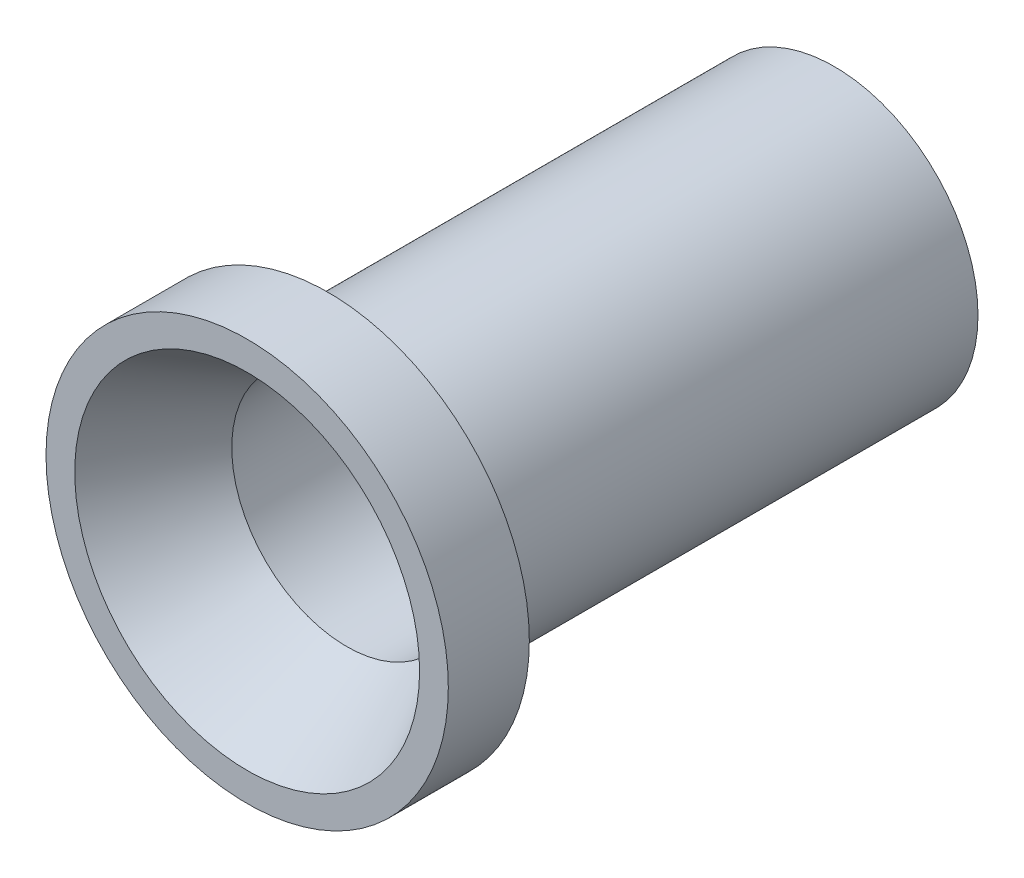
ISO-10303-21;
HEADER;
FILE_DESCRIPTION(('STEP AP214'),'2;1');
FILE_NAME('part.step','',(''),(''),'','','');
FILE_SCHEMA(('AUTOMOTIVE_DESIGN { 1 0 10303 214 1 1 1 1 }'));
ENDSEC;
DATA;
#1=APPLICATION_CONTEXT('core data for automotive mechanical design processes');
#2=APPLICATION_PROTOCOL_DEFINITION('international standard','automotive_design',2000,#1);
#3=PRODUCT_CONTEXT('',#1,'mechanical');
#4=PRODUCT('Part','Part','',(#3));
#5=PRODUCT_RELATED_PRODUCT_CATEGORY('part','',(#4));
#6=PRODUCT_DEFINITION_FORMATION('','',#4);
#7=PRODUCT_DEFINITION_CONTEXT('part definition',#1,'design');
#8=PRODUCT_DEFINITION('design','',#6,#7);
#9=PRODUCT_DEFINITION_SHAPE('','',#8);
#10=(LENGTH_UNIT() NAMED_UNIT(*) SI_UNIT(.MILLI.,.METRE.));
#11=(NAMED_UNIT(*) PLANE_ANGLE_UNIT() SI_UNIT($,.RADIAN.));
#12=(NAMED_UNIT(*) SI_UNIT($,.STERADIAN.) SOLID_ANGLE_UNIT());
#13=UNCERTAINTY_MEASURE_WITH_UNIT(LENGTH_MEASURE(1.E-05),#10,'distance_accuracy_value','');
#14=(GEOMETRIC_REPRESENTATION_CONTEXT(3) GLOBAL_UNCERTAINTY_ASSIGNED_CONTEXT((#13)) GLOBAL_UNIT_ASSIGNED_CONTEXT((#10,
#11,#12)) REPRESENTATION_CONTEXT('',''));
#15=CARTESIAN_POINT('',(0.,0.,0.));
#16=DIRECTION('',(0.,0.,1.));
#17=DIRECTION('',(1.,0.,0.));
#18=AXIS2_PLACEMENT_3D('',#15,#16,#17);
#19=CARTESIAN_POINT('',(0.,0.,0.));
#20=DIRECTION('',(0.,0.,1.));
#21=DIRECTION('',(1.,0.,0.));
#22=AXIS2_PLACEMENT_3D('',#19,#20,#21);
#23=CYLINDRICAL_SURFACE('',#22,35.);
#24=CARTESIAN_POINT('',(0.,0.,2.15777027302477));
#25=DIRECTION('',(0.,0.,1.));
#26=DIRECTION('',(1.,0.,0.));
#27=AXIS2_PLACEMENT_3D('',#24,#25,#26);
#28=CIRCLE('',#27,35.);
#29=CARTESIAN_POINT('',(35.,0.,2.15777027302477));
#30=VERTEX_POINT('',#29);
#31=EDGE_CURVE('E72',#30,#30,#28,.T.);
#32=ORIENTED_EDGE('',*,*,#31,.F.);
#33=EDGE_LOOP('',(#32));
#34=FACE_BOUND('',#33,.T.);
#35=CARTESIAN_POINT('',(0.,0.,-11.9365240935934));
#36=DIRECTION('',(0.,0.,1.));
#37=DIRECTION('',(1.,0.,0.));
#38=AXIS2_PLACEMENT_3D('',#35,#36,#37);
#39=CIRCLE('',#38,35.);
#40=CARTESIAN_POINT('',(35.,0.,-11.9365240935934));
#41=VERTEX_POINT('',#40);
#42=EDGE_CURVE('E12',#41,#41,#39,.T.);
#43=ORIENTED_EDGE('',*,*,#42,.T.);
#44=EDGE_LOOP('',(#43));
#45=FACE_BOUND('',#44,.T.);
#46=ADVANCED_FACE('F44',(#34,#45),#23,.T.);
#47=CARTESIAN_POINT('',(0.,35.,-11.9365240935934));
#48=DIRECTION('',(0.,0.,1.));
#49=DIRECTION('',(1.,0.,0.));
#50=AXIS2_PLACEMENT_3D('',#47,#48,#49);
#51=PLANE('',#50);
#52=ORIENTED_EDGE('',*,*,#42,.F.);
#53=EDGE_LOOP('',(#52));
#54=FACE_BOUND('',#53,.T.);
#55=CARTESIAN_POINT('',(0.,0.,-11.9365240935934));
#56=DIRECTION('',(0.,0.,1.));
#57=DIRECTION('',(1.,0.,0.));
#58=AXIS2_PLACEMENT_3D('',#55,#56,#57);
#59=CIRCLE('',#58,27.6332325454533);
#60=CARTESIAN_POINT('',(27.6332325454533,0.,-11.9365240935934));
#61=VERTEX_POINT('',#60);
#62=EDGE_CURVE('E50',#61,#61,#59,.T.);
#63=ORIENTED_EDGE('',*,*,#62,.T.);
#64=EDGE_LOOP('',(#63));
#65=FACE_BOUND('',#64,.T.);
#66=ADVANCED_FACE('F79',(#54,#65),#51,.F.);
#67=CARTESIAN_POINT('',(0.,0.,-16.4974166504624));
#68=DIRECTION('',(0.,0.,1.));
#69=DIRECTION('',(1.,0.,0.));
#70=AXIS2_PLACEMENT_3D('',#67,#68,#69);
#71=CONICAL_SURFACE('',#70,25.,0.5235987755983);
#72=ORIENTED_EDGE('',*,*,#62,.F.);
#73=EDGE_LOOP('',(#72));
#74=FACE_BOUND('',#73,.T.);
#75=CARTESIAN_POINT('',(0.,0.,-16.4974166504624));
#76=DIRECTION('',(0.,0.,1.));
#77=DIRECTION('',(1.,0.,0.));
#78=AXIS2_PLACEMENT_3D('',#75,#76,#77);
#79=CIRCLE('',#78,25.);
#80=CARTESIAN_POINT('',(25.,0.,-16.4974166504624));
#81=VERTEX_POINT('',#80);
#82=EDGE_CURVE('E54',#81,#81,#79,.T.);
#83=ORIENTED_EDGE('',*,*,#82,.T.);
#84=EDGE_LOOP('',(#83));
#85=FACE_BOUND('',#84,.T.);
#86=ADVANCED_FACE('F83',(#74,#85),#71,.T.);
#87=CARTESIAN_POINT('',(0.,0.,0.));
#88=DIRECTION('',(0.,0.,1.));
#89=DIRECTION('',(1.,0.,0.));
#90=AXIS2_PLACEMENT_3D('',#87,#88,#89);
#91=CYLINDRICAL_SURFACE('',#90,25.);
#92=ORIENTED_EDGE('',*,*,#82,.F.);
#93=EDGE_LOOP('',(#92));
#94=FACE_BOUND('',#93,.T.);
#95=CARTESIAN_POINT('',(0.,0.,-100.));
#96=DIRECTION('',(0.,0.,1.));
#97=DIRECTION('',(1.,0.,0.));
#98=AXIS2_PLACEMENT_3D('',#95,#96,#97);
#99=CIRCLE('',#98,25.);
#100=CARTESIAN_POINT('',(25.,0.,-100.));
#101=VERTEX_POINT('',#100);
#102=EDGE_CURVE('E58',#101,#101,#99,.T.);
#103=ORIENTED_EDGE('',*,*,#102,.T.);
#104=EDGE_LOOP('',(#103));
#105=FACE_BOUND('',#104,.T.);
#106=ADVANCED_FACE('F88',(#94,#105),#91,.T.);
#107=CARTESIAN_POINT('',(0.,25.,-100.));
#108=DIRECTION('',(0.,0.,1.));
#109=DIRECTION('',(1.,0.,0.));
#110=AXIS2_PLACEMENT_3D('',#107,#108,#109);
#111=PLANE('',#110);
#112=ORIENTED_EDGE('',*,*,#102,.F.);
#113=EDGE_LOOP('',(#112));
#114=FACE_BOUND('',#113,.T.);
#115=CARTESIAN_POINT('',(0.,0.,-100.));
#116=DIRECTION('',(0.,0.,1.));
#117=DIRECTION('',(1.,0.,0.));
#118=AXIS2_PLACEMENT_3D('',#115,#116,#117);
#119=CIRCLE('',#118,20.);
#120=CARTESIAN_POINT('',(20.,0.,-100.));
#121=VERTEX_POINT('',#120);
#122=EDGE_CURVE('E63',#121,#121,#119,.T.);
#123=ORIENTED_EDGE('',*,*,#122,.T.);
#124=EDGE_LOOP('',(#123));
#125=FACE_BOUND('',#124,.T.);
#126=ADVANCED_FACE('F94',(#114,#125),#111,.F.);
#127=CARTESIAN_POINT('',(0.,0.,0.));
#128=DIRECTION('',(0.,0.,1.));
#129=DIRECTION('',(1.,0.,0.));
#130=AXIS2_PLACEMENT_3D('',#127,#128,#129);
#131=CYLINDRICAL_SURFACE('',#130,20.);
#132=ORIENTED_EDGE('',*,*,#122,.F.);
#133=EDGE_LOOP('',(#132));
#134=FACE_BOUND('',#133,.T.);
#135=CARTESIAN_POINT('',(0.,0.,-15.162737802664));
#136=DIRECTION('',(0.,0.,1.));
#137=DIRECTION('',(1.,0.,0.));
#138=AXIS2_PLACEMENT_3D('',#135,#136,#137);
#139=CIRCLE('',#138,20.);
#140=CARTESIAN_POINT('',(20.,0.,-15.162737802664));
#141=VERTEX_POINT('',#140);
#142=EDGE_CURVE('E66',#141,#141,#139,.T.);
#143=ORIENTED_EDGE('',*,*,#142,.T.);
#144=EDGE_LOOP('',(#143));
#145=FACE_BOUND('',#144,.T.);
#146=ADVANCED_FACE('F98',(#134,#145),#131,.F.);
#147=CARTESIAN_POINT('',(0.,0.,2.15777027302477));
#148=DIRECTION('',(0.,0.,1.));
#149=DIRECTION('',(1.,0.,0.));
#150=AXIS2_PLACEMENT_3D('',#147,#148,#149);
#151=CONICAL_SURFACE('',#150,30.,0.5235987755983);
#152=ORIENTED_EDGE('',*,*,#142,.F.);
#153=EDGE_LOOP('',(#152));
#154=FACE_BOUND('',#153,.T.);
#155=CARTESIAN_POINT('',(0.,0.,2.15777027302477));
#156=DIRECTION('',(0.,0.,1.));
#157=DIRECTION('',(1.,0.,0.));
#158=AXIS2_PLACEMENT_3D('',#155,#156,#157);
#159=CIRCLE('',#158,30.);
#160=CARTESIAN_POINT('',(30.,0.,2.15777027302477));
#161=VERTEX_POINT('',#160);
#162=EDGE_CURVE('E69',#161,#161,#159,.T.);
#163=ORIENTED_EDGE('',*,*,#162,.T.);
#164=EDGE_LOOP('',(#163));
#165=FACE_BOUND('',#164,.T.);
#166=ADVANCED_FACE('F102',(#154,#165),#151,.F.);
#167=CARTESIAN_POINT('',(0.,30.,2.15777027302477));
#168=DIRECTION('',(0.,0.,-1.));
#169=DIRECTION('',(-1.,0.,0.));
#170=AXIS2_PLACEMENT_3D('',#167,#168,#169);
#171=PLANE('',#170);
#172=ORIENTED_EDGE('',*,*,#162,.F.);
#173=EDGE_LOOP('',(#172));
#174=FACE_BOUND('',#173,.T.);
#175=ORIENTED_EDGE('',*,*,#31,.T.);
#176=EDGE_LOOP('',(#175));
#177=FACE_BOUND('',#176,.T.);
#178=ADVANCED_FACE('F76',(#174,#177),#171,.F.);
#179=CLOSED_SHELL('',(#46,#66,#86,#106,#126,#146,#166,#178));
#180=MANIFOLD_SOLID_BREP('B2',#179);
#181=ADVANCED_BREP_SHAPE_REPRESENTATION('',(#18,#180),#14);
#182=SHAPE_DEFINITION_REPRESENTATION(#9,#181);
ENDSEC;
END-ISO-10303-21;
